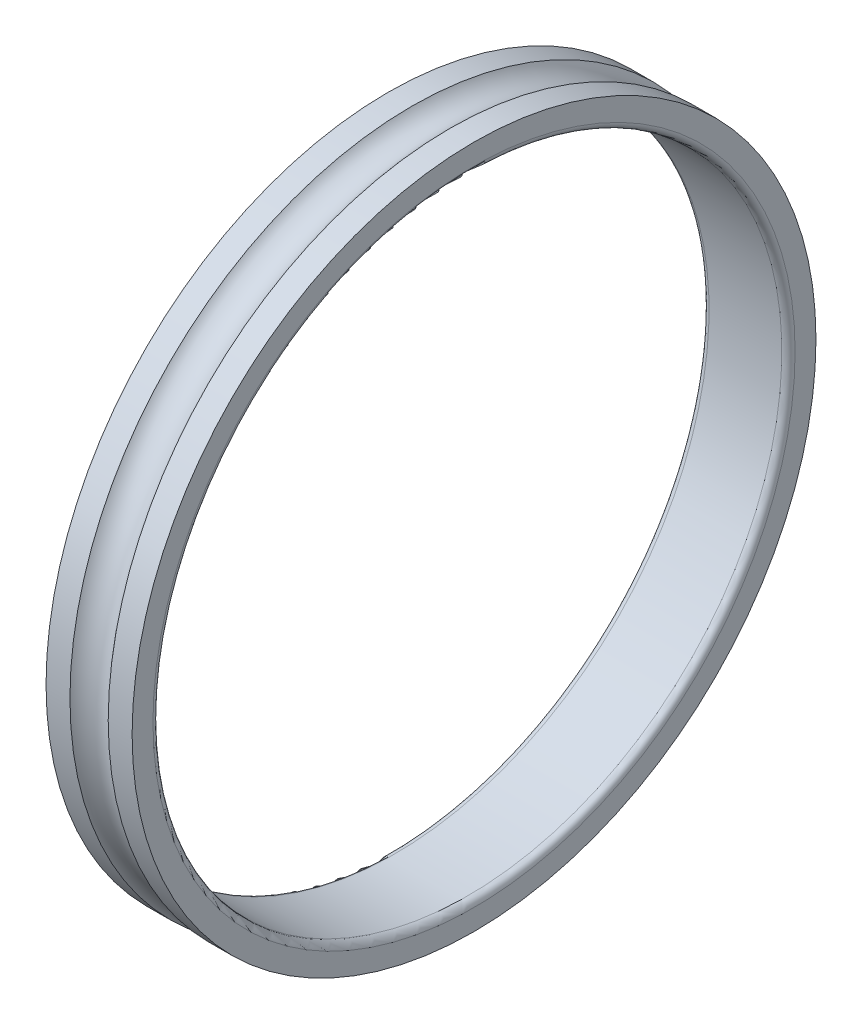
ISO-10303-21;
HEADER;
FILE_DESCRIPTION(('STEP AP214'),'2;1');
FILE_NAME('part.step','',(''),(''),'','','');
FILE_SCHEMA(('AUTOMOTIVE_DESIGN { 1 0 10303 214 1 1 1 1 }'));
ENDSEC;
DATA;
#1=APPLICATION_CONTEXT('core data for automotive mechanical design processes');
#2=APPLICATION_PROTOCOL_DEFINITION('international standard','automotive_design',2000,#1);
#3=PRODUCT_CONTEXT('',#1,'mechanical');
#4=PRODUCT('Part','Part','',(#3));
#5=PRODUCT_RELATED_PRODUCT_CATEGORY('part','',(#4));
#6=PRODUCT_DEFINITION_FORMATION('','',#4);
#7=PRODUCT_DEFINITION_CONTEXT('part definition',#1,'design');
#8=PRODUCT_DEFINITION('design','',#6,#7);
#9=PRODUCT_DEFINITION_SHAPE('','',#8);
#10=(LENGTH_UNIT() NAMED_UNIT(*) SI_UNIT(.MILLI.,.METRE.));
#11=(NAMED_UNIT(*) PLANE_ANGLE_UNIT() SI_UNIT($,.RADIAN.));
#12=(NAMED_UNIT(*) SI_UNIT($,.STERADIAN.) SOLID_ANGLE_UNIT());
#13=UNCERTAINTY_MEASURE_WITH_UNIT(LENGTH_MEASURE(1.E-05),#10,'distance_accuracy_value','');
#14=(GEOMETRIC_REPRESENTATION_CONTEXT(3) GLOBAL_UNCERTAINTY_ASSIGNED_CONTEXT((#13)) GLOBAL_UNIT_ASSIGNED_CONTEXT((#10,
#11,#12)) REPRESENTATION_CONTEXT('',''));
#15=CARTESIAN_POINT('',(0.,0.,0.));
#16=DIRECTION('',(0.,0.,1.));
#17=DIRECTION('',(1.,0.,0.));
#18=AXIS2_PLACEMENT_3D('',#15,#16,#17);
#19=CARTESIAN_POINT('',(0.99999999999922,0.,0.));
#20=DIRECTION('',(-1.,0.,0.));
#21=DIRECTION('',(0.,0.,1.));
#22=AXIS2_PLACEMENT_3D('',#19,#20,#21);
#23=TOROIDAL_SURFACE('',#22,48.4999999999992,0.999999999999219);
#24=CARTESIAN_POINT('',(1.,0.,0.));
#25=DIRECTION('',(-1.,0.,0.));
#26=DIRECTION('',(0.,0.,1.));
#27=AXIS2_PLACEMENT_3D('',#24,#25,#26);
#28=CIRCLE('',#27,47.5);
#29=CARTESIAN_POINT('',(1.,0.,47.5));
#30=VERTEX_POINT('',#29);
#31=EDGE_CURVE('E10',#30,#30,#28,.T.);
#32=ORIENTED_EDGE('',*,*,#31,.F.);
#33=EDGE_LOOP('',(#32));
#34=FACE_BOUND('',#33,.T.);
#35=CARTESIAN_POINT('',(0.,0.,0.));
#36=DIRECTION('',(-1.,0.,0.));
#37=DIRECTION('',(0.,0.,1.));
#38=AXIS2_PLACEMENT_3D('',#35,#36,#37);
#39=CIRCLE('',#38,48.5);
#40=CARTESIAN_POINT('',(0.,0.,48.5));
#41=VERTEX_POINT('',#40);
#42=EDGE_CURVE('E59',#41,#41,#39,.T.);
#43=ORIENTED_EDGE('',*,*,#42,.T.);
#44=EDGE_LOOP('',(#43));
#45=FACE_BOUND('',#44,.T.);
#46=ADVANCED_FACE('F31',(#34,#45),#23,.T.);
#47=CARTESIAN_POINT('',(50.,0.,0.));
#48=DIRECTION('',(-1.,0.,0.));
#49=DIRECTION('',(0.,0.,1.));
#50=AXIS2_PLACEMENT_3D('',#47,#48,#49);
#51=CYLINDRICAL_SURFACE('',#50,47.5);
#52=CARTESIAN_POINT('',(12.,0.,0.));
#53=DIRECTION('',(-1.,0.,0.));
#54=DIRECTION('',(0.,0.,1.));
#55=AXIS2_PLACEMENT_3D('',#52,#53,#54);
#56=CIRCLE('',#55,47.5);
#57=CARTESIAN_POINT('',(12.,0.,47.5));
#58=VERTEX_POINT('',#57);
#59=EDGE_CURVE('E37',#58,#58,#56,.T.);
#60=ORIENTED_EDGE('',*,*,#59,.F.);
#61=EDGE_LOOP('',(#60));
#62=FACE_BOUND('',#61,.T.);
#63=ORIENTED_EDGE('',*,*,#31,.T.);
#64=EDGE_LOOP('',(#63));
#65=FACE_BOUND('',#64,.T.);
#66=ADVANCED_FACE('F96',(#62,#65),#51,.F.);
#67=CARTESIAN_POINT('',(12.0000000000015,0.,0.));
#68=DIRECTION('',(-1.,0.,0.));
#69=DIRECTION('',(0.,0.,1.));
#70=AXIS2_PLACEMENT_3D('',#67,#68,#69);
#71=TOROIDAL_SURFACE('',#70,48.4999999999985,0.999999999998453);
#72=CARTESIAN_POINT('',(13.,0.,0.));
#73=DIRECTION('',(-1.,0.,0.));
#74=DIRECTION('',(0.,0.,1.));
#75=AXIS2_PLACEMENT_3D('',#72,#73,#74);
#76=CIRCLE('',#75,48.5);
#77=CARTESIAN_POINT('',(13.,0.,48.5));
#78=VERTEX_POINT('',#77);
#79=EDGE_CURVE('E41',#78,#78,#76,.T.);
#80=ORIENTED_EDGE('',*,*,#79,.F.);
#81=EDGE_LOOP('',(#80));
#82=FACE_BOUND('',#81,.T.);
#83=ORIENTED_EDGE('',*,*,#59,.T.);
#84=EDGE_LOOP('',(#83));
#85=FACE_BOUND('',#84,.T.);
#86=ADVANCED_FACE('F91',(#82,#85),#71,.T.);
#87=CARTESIAN_POINT('',(13.,48.5,0.));
#88=DIRECTION('',(-1.,0.,0.));
#89=DIRECTION('',(0.,0.,1.));
#90=AXIS2_PLACEMENT_3D('',#87,#88,#89);
#91=PLANE('',#90);
#92=CARTESIAN_POINT('',(13.,0.,0.));
#93=DIRECTION('',(-1.,0.,0.));
#94=DIRECTION('',(0.,0.,1.));
#95=AXIS2_PLACEMENT_3D('',#92,#93,#94);
#96=CIRCLE('',#95,51.65);
#97=CARTESIAN_POINT('',(13.,0.,51.65));
#98=VERTEX_POINT('',#97);
#99=EDGE_CURVE('E45',#98,#98,#96,.T.);
#100=ORIENTED_EDGE('',*,*,#99,.F.);
#101=EDGE_LOOP('',(#100));
#102=FACE_BOUND('',#101,.T.);
#103=ORIENTED_EDGE('',*,*,#79,.T.);
#104=EDGE_LOOP('',(#103));
#105=FACE_BOUND('',#104,.T.);
#106=ADVANCED_FACE('F85',(#102,#105),#91,.F.);
#107=CARTESIAN_POINT('',(50.,0.,0.));
#108=DIRECTION('',(-1.,0.,0.));
#109=DIRECTION('',(0.,0.,1.));
#110=AXIS2_PLACEMENT_3D('',#107,#108,#109);
#111=CYLINDRICAL_SURFACE('',#110,51.65);
#112=CARTESIAN_POINT('',(9.3894954576881,0.,0.));
#113=DIRECTION('',(-1.,0.,0.));
#114=DIRECTION('',(0.,0.,1.));
#115=AXIS2_PLACEMENT_3D('',#112,#113,#114);
#116=CIRCLE('',#115,51.65);
#117=CARTESIAN_POINT('',(9.3894954576881,0.,51.65));
#118=VERTEX_POINT('',#117);
#119=EDGE_CURVE('E50',#118,#118,#116,.T.);
#120=ORIENTED_EDGE('',*,*,#119,.F.);
#121=EDGE_LOOP('',(#120));
#122=FACE_BOUND('',#121,.T.);
#123=ORIENTED_EDGE('',*,*,#99,.T.);
#124=EDGE_LOOP('',(#123));
#125=FACE_BOUND('',#124,.T.);
#126=ADVANCED_FACE('F79',(#122,#125),#111,.T.);
#127=CARTESIAN_POINT('',(6.5,0.,0.));
#128=DIRECTION('',(-1.,0.,0.));
#129=DIRECTION('',(0.,0.,1.));
#130=AXIS2_PLACEMENT_3D('',#127,#128,#129);
#131=TOROIDAL_SURFACE('',#130,53.7500000000001,3.57200000000005);
#132=CARTESIAN_POINT('',(3.6105045423119,0.,0.));
#133=DIRECTION('',(-1.,0.,0.));
#134=DIRECTION('',(0.,0.,1.));
#135=AXIS2_PLACEMENT_3D('',#132,#133,#134);
#136=CIRCLE('',#135,51.65);
#137=CARTESIAN_POINT('',(3.6105045423119,0.,51.65));
#138=VERTEX_POINT('',#137);
#139=EDGE_CURVE('E53',#138,#138,#136,.T.);
#140=ORIENTED_EDGE('',*,*,#139,.F.);
#141=EDGE_LOOP('',(#140));
#142=FACE_BOUND('',#141,.T.);
#143=ORIENTED_EDGE('',*,*,#119,.T.);
#144=EDGE_LOOP('',(#143));
#145=FACE_BOUND('',#144,.T.);
#146=ADVANCED_FACE('F73',(#142,#145),#131,.F.);
#147=CARTESIAN_POINT('',(50.,0.,0.));
#148=DIRECTION('',(-1.,0.,0.));
#149=DIRECTION('',(0.,0.,1.));
#150=AXIS2_PLACEMENT_3D('',#147,#148,#149);
#151=CYLINDRICAL_SURFACE('',#150,51.65);
#152=CARTESIAN_POINT('',(0.,0.,0.));
#153=DIRECTION('',(-1.,0.,0.));
#154=DIRECTION('',(0.,0.,1.));
#155=AXIS2_PLACEMENT_3D('',#152,#153,#154);
#156=CIRCLE('',#155,51.65);
#157=CARTESIAN_POINT('',(0.,0.,51.65));
#158=VERTEX_POINT('',#157);
#159=EDGE_CURVE('E56',#158,#158,#156,.T.);
#160=ORIENTED_EDGE('',*,*,#159,.F.);
#161=EDGE_LOOP('',(#160));
#162=FACE_BOUND('',#161,.T.);
#163=ORIENTED_EDGE('',*,*,#139,.T.);
#164=EDGE_LOOP('',(#163));
#165=FACE_BOUND('',#164,.T.);
#166=ADVANCED_FACE('F67',(#162,#165),#151,.T.);
#167=CARTESIAN_POINT('',(0.,51.65,0.));
#168=DIRECTION('',(1.,0.,0.));
#169=DIRECTION('',(0.,0.,-1.));
#170=AXIS2_PLACEMENT_3D('',#167,#168,#169);
#171=PLANE('',#170);
#172=ORIENTED_EDGE('',*,*,#42,.F.);
#173=EDGE_LOOP('',(#172));
#174=FACE_BOUND('',#173,.T.);
#175=ORIENTED_EDGE('',*,*,#159,.T.);
#176=EDGE_LOOP('',(#175));
#177=FACE_BOUND('',#176,.T.);
#178=ADVANCED_FACE('F64',(#174,#177),#171,.F.);
#179=CLOSED_SHELL('',(#46,#66,#86,#106,#126,#146,#166,#178));
#180=MANIFOLD_SOLID_BREP('B2',#179);
#181=ADVANCED_BREP_SHAPE_REPRESENTATION('',(#18,#180),#14);
#182=SHAPE_DEFINITION_REPRESENTATION(#9,#181);
ENDSEC;
END-ISO-10303-21;
